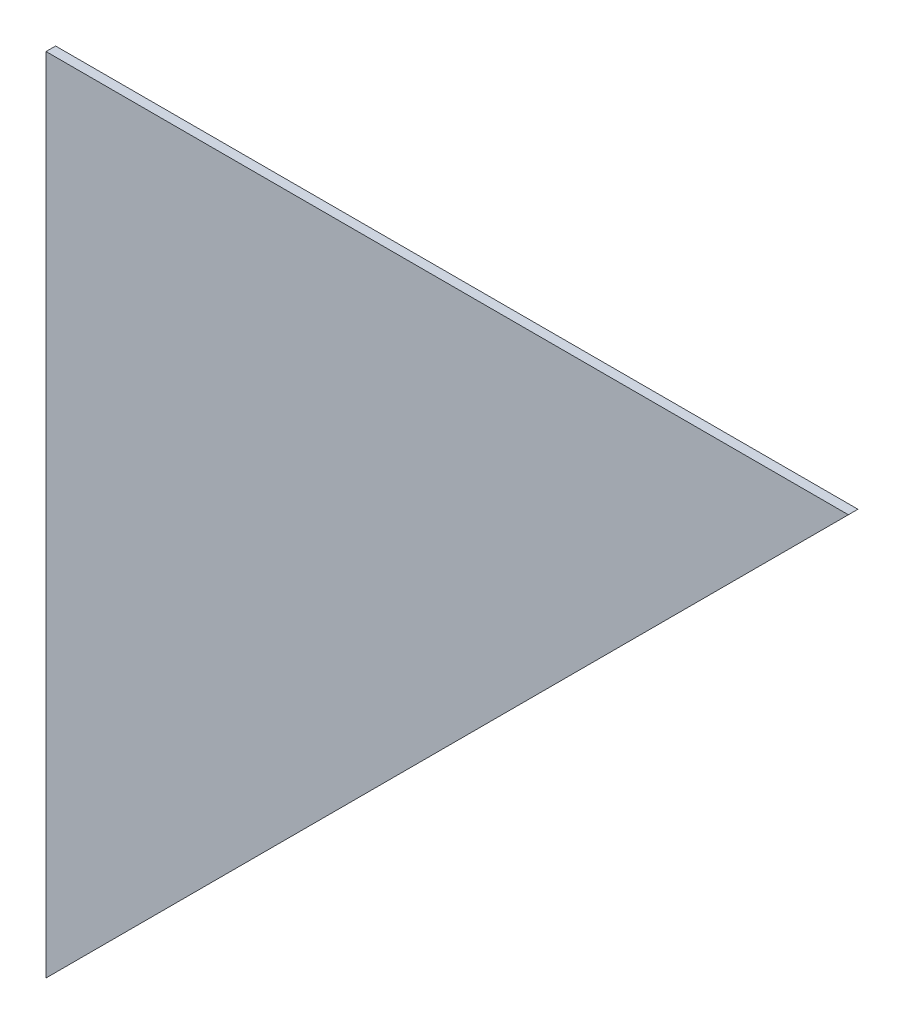
ISO-10303-21;
HEADER;
FILE_DESCRIPTION(('STEP AP214'),'2;1');
FILE_NAME('part.step','',(''),(''),'','','');
FILE_SCHEMA(('AUTOMOTIVE_DESIGN { 1 0 10303 214 1 1 1 1 }'));
ENDSEC;
DATA;
#1=APPLICATION_CONTEXT('core data for automotive mechanical design processes');
#2=APPLICATION_PROTOCOL_DEFINITION('international standard','automotive_design',2000,#1);
#3=PRODUCT_CONTEXT('',#1,'mechanical');
#4=PRODUCT('Part','Part','',(#3));
#5=PRODUCT_RELATED_PRODUCT_CATEGORY('part','',(#4));
#6=PRODUCT_DEFINITION_FORMATION('','',#4);
#7=PRODUCT_DEFINITION_CONTEXT('part definition',#1,'design');
#8=PRODUCT_DEFINITION('design','',#6,#7);
#9=PRODUCT_DEFINITION_SHAPE('','',#8);
#10=(LENGTH_UNIT() NAMED_UNIT(*) SI_UNIT(.MILLI.,.METRE.));
#11=(NAMED_UNIT(*) PLANE_ANGLE_UNIT() SI_UNIT($,.RADIAN.));
#12=(NAMED_UNIT(*) SI_UNIT($,.STERADIAN.) SOLID_ANGLE_UNIT());
#13=UNCERTAINTY_MEASURE_WITH_UNIT(LENGTH_MEASURE(1.E-05),#10,'distance_accuracy_value','');
#14=(GEOMETRIC_REPRESENTATION_CONTEXT(3) GLOBAL_UNCERTAINTY_ASSIGNED_CONTEXT((#13)) GLOBAL_UNIT_ASSIGNED_CONTEXT((#10,
#11,#12)) REPRESENTATION_CONTEXT('',''));
#15=CARTESIAN_POINT('',(0.,0.,0.));
#16=DIRECTION('',(0.,0.,1.));
#17=DIRECTION('',(1.,0.,0.));
#18=AXIS2_PLACEMENT_3D('',#15,#16,#17);
#19=CARTESIAN_POINT('',(-9.15185068961227,8.65684484743865,0.13));
#20=DIRECTION('',(1.,0.,0.));
#21=DIRECTION('',(0.,0.,-1.));
#22=AXIS2_PLACEMENT_3D('',#19,#20,#21);
#23=PLANE('',#22);
#24=DIRECTION('',(0.,-1.,0.));
#25=VECTOR('',#24,1.);
#26=CARTESIAN_POINT('',(-9.15185068961227,8.65684484743865,0.));
#27=LINE('',#26,#25);
#28=CARTESIAN_POINT('',(-9.15185068961227,19.5568448474387,0.));
#29=VERTEX_POINT('',#28);
#30=CARTESIAN_POINT('',(-9.15185068961227,8.65684484743865,0.));
#31=VERTEX_POINT('',#30);
#32=EDGE_CURVE('E89',#29,#31,#27,.T.);
#33=ORIENTED_EDGE('',*,*,#32,.T.);
#34=DIRECTION('',(0.,0.,-1.));
#35=VECTOR('',#34,1.);
#36=CARTESIAN_POINT('',(-9.15185068961227,8.65684484743865,0.13));
#37=LINE('',#36,#35);
#38=CARTESIAN_POINT('',(-9.15185068961227,8.65684484743865,0.13));
#39=VERTEX_POINT('',#38);
#40=EDGE_CURVE('E11',#39,#31,#37,.T.);
#41=ORIENTED_EDGE('',*,*,#40,.F.);
#42=DIRECTION('',(0.,-1.,0.));
#43=VECTOR('',#42,1.);
#44=CARTESIAN_POINT('',(-9.15185068961227,8.65684484743865,0.13));
#45=LINE('',#44,#43);
#46=CARTESIAN_POINT('',(-9.15185068961227,19.5568448474387,0.13));
#47=VERTEX_POINT('',#46);
#48=EDGE_CURVE('E81',#47,#39,#45,.T.);
#49=ORIENTED_EDGE('',*,*,#48,.F.);
#50=DIRECTION('',(0.,0.,-1.));
#51=VECTOR('',#50,1.);
#52=CARTESIAN_POINT('',(-9.15185068961227,19.5568448474387,0.13));
#53=LINE('',#52,#51);
#54=EDGE_CURVE('E90',#47,#29,#53,.T.);
#55=ORIENTED_EDGE('',*,*,#54,.T.);
#56=EDGE_LOOP('',(#33,#41,#49,#55));
#57=FACE_BOUND('',#56,.T.);
#58=ADVANCED_FACE('F39',(#57),#23,.F.);
#59=CARTESIAN_POINT('',(1.74814931038773,19.5568448474387,0.13));
#60=DIRECTION('',(-0.707106781186547,0.707106781186547,0.));
#61=DIRECTION('',(-0.707106781186548,-0.707106781186548,0.));
#62=AXIS2_PLACEMENT_3D('',#59,#60,#61);
#63=PLANE('',#62);
#64=DIRECTION('',(0.707106781186547,0.707106781186547,0.));
#65=VECTOR('',#64,1.);
#66=CARTESIAN_POINT('',(1.74814931038773,19.5568448474387,0.));
#67=LINE('',#66,#65);
#68=CARTESIAN_POINT('',(1.74814931038773,19.5568448474387,0.));
#69=VERTEX_POINT('',#68);
#70=EDGE_CURVE('E68',#31,#69,#67,.T.);
#71=ORIENTED_EDGE('',*,*,#70,.T.);
#72=DIRECTION('',(0.,0.,-1.));
#73=VECTOR('',#72,1.);
#74=CARTESIAN_POINT('',(1.74814931038773,19.5568448474387,0.13));
#75=LINE('',#74,#73);
#76=CARTESIAN_POINT('',(1.74814931038773,19.5568448474387,0.13));
#77=VERTEX_POINT('',#76);
#78=EDGE_CURVE('E48',#77,#69,#75,.T.);
#79=ORIENTED_EDGE('',*,*,#78,.F.);
#80=DIRECTION('',(0.707106781186547,0.707106781186547,0.));
#81=VECTOR('',#80,1.);
#82=CARTESIAN_POINT('',(1.74814931038773,19.5568448474387,0.13));
#83=LINE('',#82,#81);
#84=EDGE_CURVE('E76',#39,#77,#83,.T.);
#85=ORIENTED_EDGE('',*,*,#84,.F.);
#86=ORIENTED_EDGE('',*,*,#40,.T.);
#87=EDGE_LOOP('',(#71,#79,#85,#86));
#88=FACE_BOUND('',#87,.T.);
#89=ADVANCED_FACE('F77',(#88),#63,.F.);
#90=CARTESIAN_POINT('',(-9.15185068961227,19.5568448474387,0.13));
#91=DIRECTION('',(0.,-1.,0.));
#92=DIRECTION('',(0.,0.,-1.));
#93=AXIS2_PLACEMENT_3D('',#90,#91,#92);
#94=PLANE('',#93);
#95=DIRECTION('',(-1.,0.,0.));
#96=VECTOR('',#95,1.);
#97=CARTESIAN_POINT('',(-9.15185068961227,19.5568448474387,0.));
#98=LINE('',#97,#96);
#99=EDGE_CURVE('E73',#69,#29,#98,.T.);
#100=ORIENTED_EDGE('',*,*,#99,.T.);
#101=ORIENTED_EDGE('',*,*,#54,.F.);
#102=DIRECTION('',(-1.,0.,0.));
#103=VECTOR('',#102,1.);
#104=CARTESIAN_POINT('',(-9.15185068961227,19.5568448474387,0.13));
#105=LINE('',#104,#103);
#106=EDGE_CURVE('E56',#77,#47,#105,.T.);
#107=ORIENTED_EDGE('',*,*,#106,.F.);
#108=ORIENTED_EDGE('',*,*,#78,.T.);
#109=EDGE_LOOP('',(#100,#101,#107,#108));
#110=FACE_BOUND('',#109,.T.);
#111=ADVANCED_FACE('F102',(#110),#94,.F.);
#112=CARTESIAN_POINT('',(0.,0.,0.13));
#113=DIRECTION('',(0.,0.,-1.));
#114=DIRECTION('',(-1.,0.,0.));
#115=AXIS2_PLACEMENT_3D('',#112,#113,#114);
#116=PLANE('',#115);
#117=ORIENTED_EDGE('',*,*,#48,.T.);
#118=ORIENTED_EDGE('',*,*,#84,.T.);
#119=ORIENTED_EDGE('',*,*,#106,.T.);
#120=EDGE_LOOP('',(#117,#118,#119));
#121=FACE_BOUND('',#120,.T.);
#122=ADVANCED_FACE('F84',(#121),#116,.F.);
#123=CARTESIAN_POINT('',(0.,0.,0.));
#124=DIRECTION('',(0.,0.,-1.));
#125=DIRECTION('',(-1.,0.,0.));
#126=AXIS2_PLACEMENT_3D('',#123,#124,#125);
#127=PLANE('',#126);
#128=ORIENTED_EDGE('',*,*,#32,.F.);
#129=ORIENTED_EDGE('',*,*,#99,.F.);
#130=ORIENTED_EDGE('',*,*,#70,.F.);
#131=EDGE_LOOP('',(#128,#129,#130));
#132=FACE_BOUND('',#131,.T.);
#133=ADVANCED_FACE('F103',(#132),#127,.T.);
#134=CLOSED_SHELL('',(#58,#89,#111,#122,#133));
#135=MANIFOLD_SOLID_BREP('B2',#134);
#136=ADVANCED_BREP_SHAPE_REPRESENTATION('',(#18,#135),#14);
#137=SHAPE_DEFINITION_REPRESENTATION(#9,#136);
ENDSEC;
END-ISO-10303-21;
